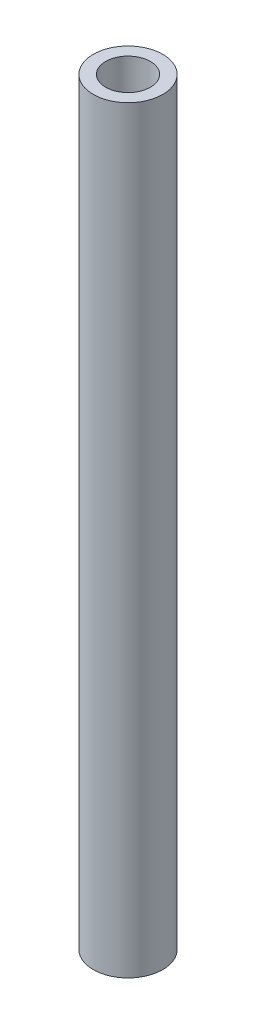
ISO-10303-21;
HEADER;
FILE_DESCRIPTION(('STEP AP214'),'2;1');
FILE_NAME('part.step','',(''),(''),'','','');
FILE_SCHEMA(('AUTOMOTIVE_DESIGN { 1 0 10303 214 1 1 1 1 }'));
ENDSEC;
DATA;
#1=APPLICATION_CONTEXT('core data for automotive mechanical design processes');
#2=APPLICATION_PROTOCOL_DEFINITION('international standard','automotive_design',2000,#1);
#3=PRODUCT_CONTEXT('',#1,'mechanical');
#4=PRODUCT('Part','Part','',(#3));
#5=PRODUCT_RELATED_PRODUCT_CATEGORY('part','',(#4));
#6=PRODUCT_DEFINITION_FORMATION('','',#4);
#7=PRODUCT_DEFINITION_CONTEXT('part definition',#1,'design');
#8=PRODUCT_DEFINITION('design','',#6,#7);
#9=PRODUCT_DEFINITION_SHAPE('','',#8);
#10=(LENGTH_UNIT() NAMED_UNIT(*) SI_UNIT(.MILLI.,.METRE.));
#11=(NAMED_UNIT(*) PLANE_ANGLE_UNIT() SI_UNIT($,.RADIAN.));
#12=(NAMED_UNIT(*) SI_UNIT($,.STERADIAN.) SOLID_ANGLE_UNIT());
#13=UNCERTAINTY_MEASURE_WITH_UNIT(LENGTH_MEASURE(1.E-05),#10,'distance_accuracy_value','');
#14=(GEOMETRIC_REPRESENTATION_CONTEXT(3) GLOBAL_UNCERTAINTY_ASSIGNED_CONTEXT((#13)) GLOBAL_UNIT_ASSIGNED_CONTEXT((#10,
#11,#12)) REPRESENTATION_CONTEXT('',''));
#15=CARTESIAN_POINT('',(0.,0.,0.));
#16=DIRECTION('',(0.,0.,1.));
#17=DIRECTION('',(1.,0.,0.));
#18=AXIS2_PLACEMENT_3D('',#15,#16,#17);
#19=CARTESIAN_POINT('',(0.,54.2,0.));
#20=DIRECTION('',(0.,-1.,0.));
#21=DIRECTION('',(0.,0.,-1.));
#22=AXIS2_PLACEMENT_3D('',#19,#20,#21);
#23=CYLINDRICAL_SURFACE('',#22,2.485);
#24=CARTESIAN_POINT('',(0.,54.2,0.));
#25=DIRECTION('',(0.,1.,0.));
#26=DIRECTION('',(0.,0.,1.));
#27=AXIS2_PLACEMENT_3D('',#24,#25,#26);
#28=CIRCLE('',#27,2.485);
#29=CARTESIAN_POINT('',(0.,54.2,-2.485));
#30=VERTEX_POINT('',#29);
#31=EDGE_CURVE('E11',#30,#30,#28,.T.);
#32=CARTESIAN_POINT('',(0.,0.,0.));
#33=DIRECTION('',(0.,1.,0.));
#34=DIRECTION('',(0.,0.,1.));
#35=AXIS2_PLACEMENT_3D('',#32,#33,#34);
#36=CIRCLE('',#35,2.485);
#37=CARTESIAN_POINT('',(0.,0.,-2.485));
#38=VERTEX_POINT('',#37);
#39=EDGE_CURVE('E39',#38,#38,#36,.T.);
#40=CARTESIAN_POINT('',(0.,54.2,-2.485));
#41=CARTESIAN_POINT('',(0.,53.6354166666667,-2.485));
#42=CARTESIAN_POINT('',(0.,53.0708333333333,-2.485));
#43=CARTESIAN_POINT('',(0.,51.9416666666667,-2.485));
#44=CARTESIAN_POINT('',(0.,51.3770833333333,-2.485));
#45=CARTESIAN_POINT('',(0.,50.2479166666667,-2.485));
#46=CARTESIAN_POINT('',(0.,49.6833333333333,-2.485));
#47=CARTESIAN_POINT('',(0.,48.5541666666667,-2.485));
#48=CARTESIAN_POINT('',(0.,47.9895833333333,-2.485));
#49=CARTESIAN_POINT('',(0.,46.8604166666667,-2.485));
#50=CARTESIAN_POINT('',(0.,46.2958333333333,-2.485));
#51=CARTESIAN_POINT('',(0.,45.1666666666667,-2.485));
#52=CARTESIAN_POINT('',(0.,44.6020833333333,-2.485));
#53=CARTESIAN_POINT('',(0.,43.4729166666667,-2.485));
#54=CARTESIAN_POINT('',(0.,42.9083333333333,-2.485));
#55=CARTESIAN_POINT('',(0.,41.7791666666667,-2.485));
#56=CARTESIAN_POINT('',(0.,41.2145833333333,-2.485));
#57=CARTESIAN_POINT('',(0.,40.0854166666667,-2.485));
#58=CARTESIAN_POINT('',(0.,39.5208333333333,-2.485));
#59=CARTESIAN_POINT('',(0.,38.3916666666667,-2.485));
#60=CARTESIAN_POINT('',(0.,37.8270833333333,-2.485));
#61=CARTESIAN_POINT('',(0.,36.6979166666667,-2.485));
#62=CARTESIAN_POINT('',(0.,36.1333333333333,-2.485));
#63=CARTESIAN_POINT('',(0.,35.0041666666667,-2.485));
#64=CARTESIAN_POINT('',(0.,34.4395833333333,-2.485));
#65=CARTESIAN_POINT('',(0.,33.3104166666667,-2.485));
#66=CARTESIAN_POINT('',(0.,32.7458333333333,-2.485));
#67=CARTESIAN_POINT('',(0.,31.6166666666667,-2.485));
#68=CARTESIAN_POINT('',(0.,31.0520833333333,-2.485));
#69=CARTESIAN_POINT('',(0.,29.9229166666667,-2.485));
#70=CARTESIAN_POINT('',(0.,29.3583333333333,-2.485));
#71=CARTESIAN_POINT('',(0.,28.2291666666667,-2.485));
#72=CARTESIAN_POINT('',(0.,27.6645833333333,-2.485));
#73=CARTESIAN_POINT('',(0.,26.5354166666667,-2.485));
#74=CARTESIAN_POINT('',(0.,25.9708333333333,-2.485));
#75=CARTESIAN_POINT('',(0.,24.8416666666667,-2.485));
#76=CARTESIAN_POINT('',(0.,24.2770833333333,-2.485));
#77=CARTESIAN_POINT('',(0.,23.1479166666667,-2.485));
#78=CARTESIAN_POINT('',(0.,22.5833333333333,-2.485));
#79=CARTESIAN_POINT('',(0.,21.4541666666667,-2.485));
#80=CARTESIAN_POINT('',(0.,20.8895833333333,-2.485));
#81=CARTESIAN_POINT('',(0.,19.7604166666667,-2.485));
#82=CARTESIAN_POINT('',(0.,19.1958333333333,-2.485));
#83=CARTESIAN_POINT('',(0.,18.0666666666667,-2.485));
#84=CARTESIAN_POINT('',(0.,17.5020833333333,-2.485));
#85=CARTESIAN_POINT('',(0.,16.3729166666667,-2.485));
#86=CARTESIAN_POINT('',(0.,15.8083333333333,-2.485));
#87=CARTESIAN_POINT('',(0.,14.6791666666667,-2.485));
#88=CARTESIAN_POINT('',(0.,14.1145833333333,-2.485));
#89=CARTESIAN_POINT('',(0.,12.9854166666667,-2.485));
#90=CARTESIAN_POINT('',(0.,12.4208333333333,-2.485));
#91=CARTESIAN_POINT('',(0.,11.2916666666667,-2.485));
#92=CARTESIAN_POINT('',(0.,10.7270833333333,-2.485));
#93=CARTESIAN_POINT('',(0.,9.59791666666667,-2.485));
#94=CARTESIAN_POINT('',(0.,9.03333333333334,-2.485));
#95=CARTESIAN_POINT('',(0.,7.90416666666667,-2.485));
#96=CARTESIAN_POINT('',(0.,7.33958333333334,-2.485));
#97=CARTESIAN_POINT('',(0.,6.21041666666667,-2.485));
#98=CARTESIAN_POINT('',(0.,5.64583333333334,-2.485));
#99=CARTESIAN_POINT('',(0.,4.51666666666667,-2.485));
#100=CARTESIAN_POINT('',(0.,3.95208333333334,-2.485));
#101=CARTESIAN_POINT('',(0.,2.82291666666667,-2.485));
#102=CARTESIAN_POINT('',(0.,2.25833333333333,-2.485));
#103=CARTESIAN_POINT('',(0.,1.12916666666667,-2.485));
#104=CARTESIAN_POINT('',(0.,0.564583333333334,-2.485));
#105=CARTESIAN_POINT('',(0.,0.,-2.485));
#106=B_SPLINE_CURVE_WITH_KNOTS('',3,(#40,#41,#42,#43,#44,#45,#46,#47,#48,#49,#50,#51,#52,#53,
#54,#55,#56,#57,#58,#59,#60,#61,#62,#63,#64,#65,#66,#67,#68,#69,#70,#71,#72,#73,#74,#75,#76,#77,
#78,#79,#80,#81,#82,#83,#84,#85,#86,#87,#88,#89,#90,#91,#92,#93,#94,#95,#96,#97,#98,#99,#100,
#101,#102,#103,#104,#105),.UNSPECIFIED.,.F.,.F.,(4,2,2,2,2,2,2,2,2,2,2,2,2,2,2,2,2,2,2,2,2,2,2,
2,2,2,2,2,2,2,2,2,4),(0.,1.69374999999999,3.38749999999999,5.08125,6.775,8.46875,10.1625,
11.85625,13.55,15.24375,16.9375,18.63125,20.325,22.01875,23.7125,25.40625,27.1,28.79375,30.4875,
32.18125,33.875,35.56875,37.2625,38.95625,40.65,42.34375,44.0375,45.73125,47.425,49.11875,
50.8125,52.50625,54.2),.UNSPECIFIED.);
#107=EDGE_CURVE('BSEAM36',#30,#38,#106,.T.);
#108=ORIENTED_EDGE('',*,*,#31,.F.);
#109=ORIENTED_EDGE('',*,*,#39,.T.);
#110=ORIENTED_EDGE('',*,*,#107,.T.);
#111=ORIENTED_EDGE('',*,*,#107,.F.);
#112=EDGE_LOOP('',(#108,#110,#109,#111));
#113=FACE_BOUND('',#112,.T.);
#114=ADVANCED_FACE('F36',(#113),#23,.T.);
#115=CARTESIAN_POINT('',(0.,54.2,0.));
#116=DIRECTION('',(0.,1.,0.));
#117=DIRECTION('',(0.,0.,1.));
#118=AXIS2_PLACEMENT_3D('',#115,#116,#117);
#119=PLANE('',#118);
#120=CARTESIAN_POINT('',(0.,54.2,0.));
#121=DIRECTION('',(0.,1.,0.));
#122=DIRECTION('',(0.,0.,1.));
#123=AXIS2_PLACEMENT_3D('',#120,#121,#122);
#124=CIRCLE('',#123,1.6);
#125=CARTESIAN_POINT('',(0.,54.2,1.6));
#126=VERTEX_POINT('',#125);
#127=EDGE_CURVE('E55',#126,#126,#124,.T.);
#128=ORIENTED_EDGE('',*,*,#127,.F.);
#129=EDGE_LOOP('',(#128));
#130=FACE_BOUND('',#129,.T.);
#131=ORIENTED_EDGE('',*,*,#31,.T.);
#132=EDGE_LOOP('',(#131));
#133=FACE_BOUND('',#132,.T.);
#134=ADVANCED_FACE('F63',(#130,#133),#119,.T.);
#135=CARTESIAN_POINT('',(0.,0.,0.));
#136=DIRECTION('',(0.,1.,0.));
#137=DIRECTION('',(0.,0.,1.));
#138=AXIS2_PLACEMENT_3D('',#135,#136,#137);
#139=PLANE('',#138);
#140=ORIENTED_EDGE('',*,*,#39,.F.);
#141=EDGE_LOOP('',(#140));
#142=FACE_BOUND('',#141,.T.);
#143=ADVANCED_FACE('F49',(#142),#139,.F.);
#144=CARTESIAN_POINT('',(0.,43.2,0.));
#145=DIRECTION('',(0.,1.,0.));
#146=DIRECTION('',(0.,0.,1.));
#147=AXIS2_PLACEMENT_3D('',#144,#145,#146);
#148=CONICAL_SURFACE('',#147,1.6,1.02974425867665);
#149=CARTESIAN_POINT('',(0.,42.2386230095559,0.));
#150=VERTEX_POINT('',#149);
#151=VERTEX_LOOP('',#150);
#152=FACE_BOUND('',#151,.T.);
#153=CARTESIAN_POINT('',(0.,43.2,0.));
#154=DIRECTION('',(0.,1.,0.));
#155=DIRECTION('',(0.,0.,1.));
#156=AXIS2_PLACEMENT_3D('',#153,#154,#155);
#157=CIRCLE('',#156,1.6);
#158=CARTESIAN_POINT('',(0.,43.2,1.6));
#159=VERTEX_POINT('',#158);
#160=EDGE_CURVE('E53',#159,#159,#157,.T.);
#161=ORIENTED_EDGE('',*,*,#160,.T.);
#162=EDGE_LOOP('',(#161));
#163=FACE_BOUND('',#162,.T.);
#164=ADVANCED_FACE('F45',(#152,#163),#148,.F.);
#165=CARTESIAN_POINT('',(0.,54.2,0.));
#166=DIRECTION('',(0.,1.,0.));
#167=DIRECTION('',(0.,0.,1.));
#168=AXIS2_PLACEMENT_3D('',#165,#166,#167);
#169=CYLINDRICAL_SURFACE('',#168,1.6);
#170=ORIENTED_EDGE('',*,*,#160,.F.);
#171=EDGE_LOOP('',(#170));
#172=FACE_BOUND('',#171,.T.);
#173=ORIENTED_EDGE('',*,*,#127,.T.);
#174=EDGE_LOOP('',(#173));
#175=FACE_BOUND('',#174,.T.);
#176=ADVANCED_FACE('F48',(#172,#175),#169,.F.);
#177=CLOSED_SHELL('',(#114,#134,#143,#164,#176));
#178=MANIFOLD_SOLID_BREP('B2',#177);
#179=ADVANCED_BREP_SHAPE_REPRESENTATION('',(#18,#178),#14);
#180=SHAPE_DEFINITION_REPRESENTATION(#9,#179);
ENDSEC;
END-ISO-10303-21;
